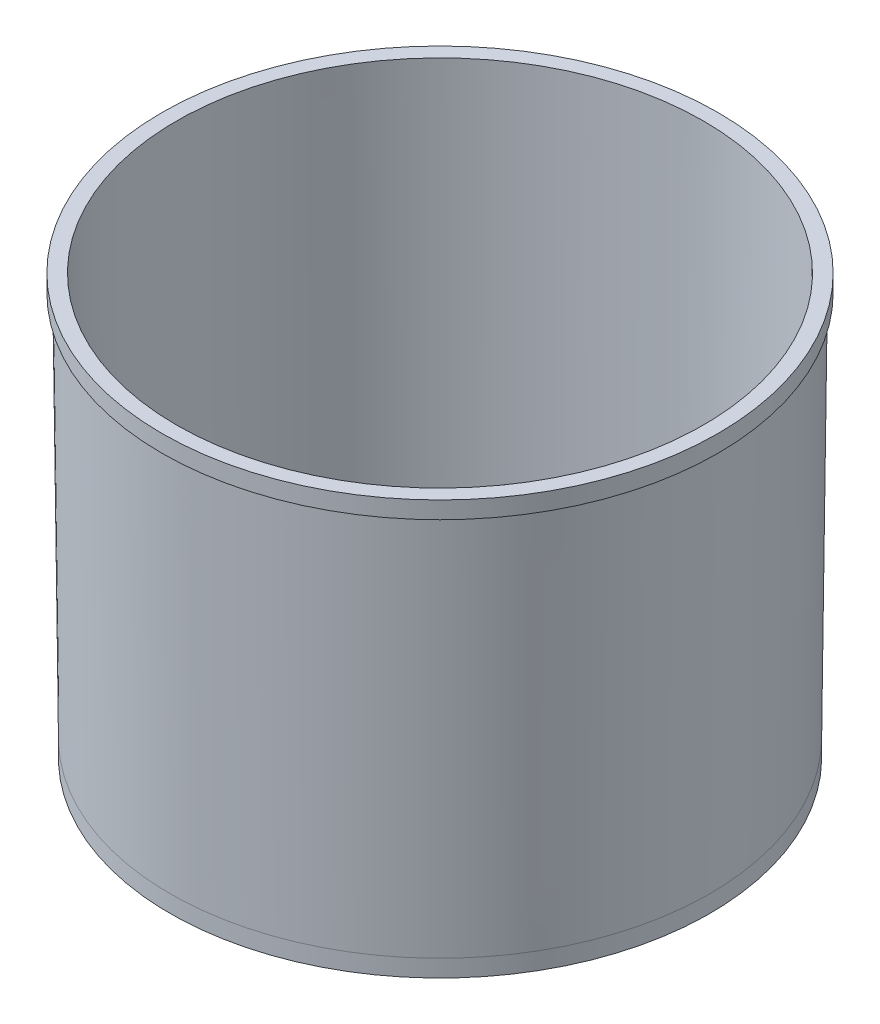
ISO-10303-21;
HEADER;
FILE_DESCRIPTION(('STEP AP214'),'2;1');
FILE_NAME('part.step','',(''),(''),'','','');
FILE_SCHEMA(('AUTOMOTIVE_DESIGN { 1 0 10303 214 1 1 1 1 }'));
ENDSEC;
DATA;
#1=APPLICATION_CONTEXT('core data for automotive mechanical design processes');
#2=APPLICATION_PROTOCOL_DEFINITION('international standard','automotive_design',2000,#1);
#3=PRODUCT_CONTEXT('',#1,'mechanical');
#4=PRODUCT('Part','Part','',(#3));
#5=PRODUCT_RELATED_PRODUCT_CATEGORY('part','',(#4));
#6=PRODUCT_DEFINITION_FORMATION('','',#4);
#7=PRODUCT_DEFINITION_CONTEXT('part definition',#1,'design');
#8=PRODUCT_DEFINITION('design','',#6,#7);
#9=PRODUCT_DEFINITION_SHAPE('','',#8);
#10=(LENGTH_UNIT() NAMED_UNIT(*) SI_UNIT(.MILLI.,.METRE.));
#11=(NAMED_UNIT(*) PLANE_ANGLE_UNIT() SI_UNIT($,.RADIAN.));
#12=(NAMED_UNIT(*) SI_UNIT($,.STERADIAN.) SOLID_ANGLE_UNIT());
#13=UNCERTAINTY_MEASURE_WITH_UNIT(LENGTH_MEASURE(1.E-05),#10,'distance_accuracy_value','');
#14=(GEOMETRIC_REPRESENTATION_CONTEXT(3) GLOBAL_UNCERTAINTY_ASSIGNED_CONTEXT((#13)) GLOBAL_UNIT_ASSIGNED_CONTEXT((#10,
#11,#12)) REPRESENTATION_CONTEXT('',''));
#15=CARTESIAN_POINT('',(0.,0.,0.));
#16=DIRECTION('',(0.,0.,1.));
#17=DIRECTION('',(1.,0.,0.));
#18=AXIS2_PLACEMENT_3D('',#15,#16,#17);
#19=CARTESIAN_POINT('',(-30.75,47.,0.));
#20=DIRECTION('',(0.,-1.,0.));
#21=DIRECTION('',(0.,0.,-1.));
#22=AXIS2_PLACEMENT_3D('',#19,#20,#21);
#23=PLANE('',#22);
#24=CARTESIAN_POINT('',(0.,47.,0.));
#25=DIRECTION('',(0.,-1.,0.));
#26=DIRECTION('',(0.,0.,-1.));
#27=AXIS2_PLACEMENT_3D('',#24,#25,#26);
#28=CIRCLE('',#27,32.45);
#29=CARTESIAN_POINT('',(0.,47.,-32.45));
#30=VERTEX_POINT('',#29);
#31=EDGE_CURVE('E10',#30,#30,#28,.T.);
#32=ORIENTED_EDGE('',*,*,#31,.F.);
#33=EDGE_LOOP('',(#32));
#34=FACE_BOUND('',#33,.T.);
#35=CARTESIAN_POINT('',(0.,47.,0.));
#36=DIRECTION('',(0.,-1.,0.));
#37=DIRECTION('',(0.,0.,-1.));
#38=AXIS2_PLACEMENT_3D('',#35,#36,#37);
#39=CIRCLE('',#38,30.75);
#40=CARTESIAN_POINT('',(0.,47.,-30.75));
#41=VERTEX_POINT('',#40);
#42=EDGE_CURVE('E53',#41,#41,#39,.T.);
#43=ORIENTED_EDGE('',*,*,#42,.T.);
#44=EDGE_LOOP('',(#43));
#45=FACE_BOUND('',#44,.T.);
#46=ADVANCED_FACE('F34',(#34,#45),#23,.F.);
#47=CARTESIAN_POINT('',(0.,-2.4,0.));
#48=DIRECTION('',(0.,-1.,0.));
#49=DIRECTION('',(0.,0.,-1.));
#50=AXIS2_PLACEMENT_3D('',#47,#48,#49);
#51=CYLINDRICAL_SURFACE('',#50,32.45);
#52=CARTESIAN_POINT('',(0.,45.,0.));
#53=DIRECTION('',(0.,-1.,0.));
#54=DIRECTION('',(0.,0.,-1.));
#55=AXIS2_PLACEMENT_3D('',#52,#53,#54);
#56=CIRCLE('',#55,32.45);
#57=CARTESIAN_POINT('',(0.,45.,-32.45));
#58=VERTEX_POINT('',#57);
#59=EDGE_CURVE('E40',#58,#58,#56,.T.);
#60=ORIENTED_EDGE('',*,*,#59,.F.);
#61=EDGE_LOOP('',(#60));
#62=FACE_BOUND('',#61,.T.);
#63=ORIENTED_EDGE('',*,*,#31,.T.);
#64=EDGE_LOOP('',(#63));
#65=FACE_BOUND('',#64,.T.);
#66=ADVANCED_FACE('F86',(#62,#65),#51,.T.);
#67=CARTESIAN_POINT('',(-32.45,45.,0.));
#68=DIRECTION('',(0.,1.,0.));
#69=DIRECTION('',(0.,0.,1.));
#70=AXIS2_PLACEMENT_3D('',#67,#68,#69);
#71=PLANE('',#70);
#72=CARTESIAN_POINT('',(0.,45.,0.));
#73=DIRECTION('',(0.,-1.,0.));
#74=DIRECTION('',(0.,0.,-1.));
#75=AXIS2_PLACEMENT_3D('',#72,#73,#74);
#76=CIRCLE('',#75,31.9787911449388);
#77=CARTESIAN_POINT('',(0.,45.,-31.9787911449388));
#78=VERTEX_POINT('',#77);
#79=EDGE_CURVE('E44',#78,#78,#76,.T.);
#80=ORIENTED_EDGE('',*,*,#79,.F.);
#81=EDGE_LOOP('',(#80));
#82=FACE_BOUND('',#81,.T.);
#83=ORIENTED_EDGE('',*,*,#59,.T.);
#84=EDGE_LOOP('',(#83));
#85=FACE_BOUND('',#84,.T.);
#86=ADVANCED_FACE('F91',(#82,#85),#71,.F.);
#87=CARTESIAN_POINT('',(0.,45.,0.));
#88=DIRECTION('',(0.,1.,0.));
#89=DIRECTION('',(0.,0.,1.));
#90=AXIS2_PLACEMENT_3D('',#87,#88,#89);
#91=CONICAL_SURFACE('',#90,31.9787911449388,0.0106394017536936);
#92=CARTESIAN_POINT('',(0.,0.,0.));
#93=DIRECTION('',(0.,-1.,0.));
#94=DIRECTION('',(0.,0.,-1.));
#95=AXIS2_PLACEMENT_3D('',#92,#93,#94);
#96=CIRCLE('',#95,31.5);
#97=CARTESIAN_POINT('',(0.,0.,-31.5));
#98=VERTEX_POINT('',#97);
#99=EDGE_CURVE('E48',#98,#98,#96,.T.);
#100=ORIENTED_EDGE('',*,*,#99,.F.);
#101=EDGE_LOOP('',(#100));
#102=FACE_BOUND('',#101,.T.);
#103=ORIENTED_EDGE('',*,*,#79,.T.);
#104=EDGE_LOOP('',(#103));
#105=FACE_BOUND('',#104,.T.);
#106=ADVANCED_FACE('F81',(#102,#105),#91,.T.);
#107=CARTESIAN_POINT('',(0.,0.,0.));
#108=DIRECTION('',(0.,1.,0.));
#109=DIRECTION('',(0.,0.,1.));
#110=AXIS2_PLACEMENT_3D('',#107,#108,#109);
#111=CONICAL_SURFACE('',#110,30.2499292486194,0.0106394017536938);
#112=ORIENTED_EDGE('',*,*,#42,.F.);
#113=EDGE_LOOP('',(#112));
#114=FACE_BOUND('',#113,.T.);
#115=CARTESIAN_POINT('',(0.,0.,0.));
#116=DIRECTION('',(0.,-1.,0.));
#117=DIRECTION('',(0.,0.,-1.));
#118=AXIS2_PLACEMENT_3D('',#115,#116,#117);
#119=CIRCLE('',#118,30.2499292486194);
#120=CARTESIAN_POINT('',(0.,0.,-30.2499292486194));
#121=VERTEX_POINT('',#120);
#122=EDGE_CURVE('E60',#121,#121,#119,.T.);
#123=ORIENTED_EDGE('',*,*,#122,.T.);
#124=EDGE_LOOP('',(#123));
#125=FACE_BOUND('',#124,.T.);
#126=ADVANCED_FACE('F72',(#114,#125),#111,.F.);
#127=CARTESIAN_POINT('',(0.,-2.,0.));
#128=DIRECTION('',(0.,-1.,0.));
#129=DIRECTION('',(0.,0.,-1.));
#130=AXIS2_PLACEMENT_3D('',#127,#128,#129);
#131=PLANE('',#130);
#132=CARTESIAN_POINT('',(0.,-2.,0.));
#133=DIRECTION('',(0.,-1.,0.));
#134=DIRECTION('',(0.,0.,-1.));
#135=AXIS2_PLACEMENT_3D('',#132,#133,#134);
#136=CIRCLE('',#135,31.5);
#137=CARTESIAN_POINT('',(0.,-2.,-31.5));
#138=VERTEX_POINT('',#137);
#139=EDGE_CURVE('E56',#138,#138,#136,.T.);
#140=ORIENTED_EDGE('',*,*,#139,.T.);
#141=EDGE_LOOP('',(#140));
#142=FACE_BOUND('',#141,.T.);
#143=CARTESIAN_POINT('',(0.,-2.,0.));
#144=DIRECTION('',(0.,-1.,0.));
#145=DIRECTION('',(0.,0.,-1.));
#146=AXIS2_PLACEMENT_3D('',#143,#144,#145);
#147=CIRCLE('',#146,30.2499292486194);
#148=CARTESIAN_POINT('',(0.,-2.,-30.2499292486194));
#149=VERTEX_POINT('',#148);
#150=EDGE_CURVE('E59',#149,#149,#147,.T.);
#151=ORIENTED_EDGE('',*,*,#150,.F.);
#152=EDGE_LOOP('',(#151));
#153=FACE_BOUND('',#152,.T.);
#154=ADVANCED_FACE('F69',(#142,#153),#131,.T.);
#155=CARTESIAN_POINT('',(0.,-2.,0.));
#156=DIRECTION('',(0.,1.,0.));
#157=DIRECTION('',(0.,0.,1.));
#158=AXIS2_PLACEMENT_3D('',#155,#156,#157);
#159=CYLINDRICAL_SURFACE('',#158,31.5);
#160=ORIENTED_EDGE('',*,*,#139,.F.);
#161=EDGE_LOOP('',(#160));
#162=FACE_BOUND('',#161,.T.);
#163=ORIENTED_EDGE('',*,*,#99,.T.);
#164=EDGE_LOOP('',(#163));
#165=FACE_BOUND('',#164,.T.);
#166=ADVANCED_FACE('F71',(#162,#165),#159,.T.);
#167=CARTESIAN_POINT('',(0.,-2.,0.));
#168=DIRECTION('',(0.,1.,0.));
#169=DIRECTION('',(0.,0.,1.));
#170=AXIS2_PLACEMENT_3D('',#167,#168,#169);
#171=CYLINDRICAL_SURFACE('',#170,30.2499292486194);
#172=ORIENTED_EDGE('',*,*,#150,.T.);
#173=EDGE_LOOP('',(#172));
#174=FACE_BOUND('',#173,.T.);
#175=ORIENTED_EDGE('',*,*,#122,.F.);
#176=EDGE_LOOP('',(#175));
#177=FACE_BOUND('',#176,.T.);
#178=ADVANCED_FACE('F66',(#174,#177),#171,.F.);
#179=CLOSED_SHELL('',(#46,#66,#86,#106,#126,#154,#166,#178));
#180=MANIFOLD_SOLID_BREP('B2',#179);
#181=ADVANCED_BREP_SHAPE_REPRESENTATION('',(#18,#180),#14);
#182=SHAPE_DEFINITION_REPRESENTATION(#9,#181);
ENDSEC;
END-ISO-10303-21;
